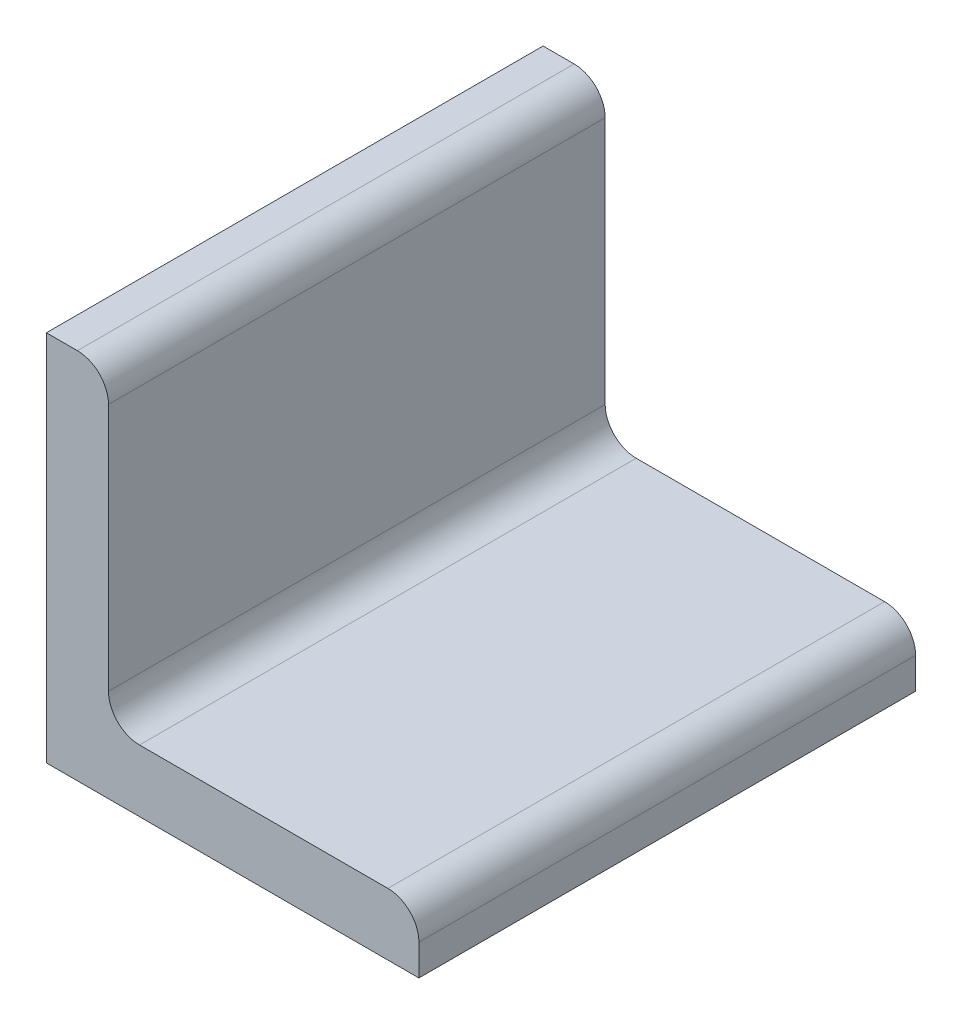
ISO-10303-21;
HEADER;
FILE_DESCRIPTION(('STEP AP214'),'2;1');
FILE_NAME('part.step','',(''),(''),'','','');
FILE_SCHEMA(('AUTOMOTIVE_DESIGN { 1 0 10303 214 1 1 1 1 }'));
ENDSEC;
DATA;
#1=APPLICATION_CONTEXT('core data for automotive mechanical design processes');
#2=APPLICATION_PROTOCOL_DEFINITION('international standard','automotive_design',2000,#1);
#3=PRODUCT_CONTEXT('',#1,'mechanical');
#4=PRODUCT('Part','Part','',(#3));
#5=PRODUCT_RELATED_PRODUCT_CATEGORY('part','',(#4));
#6=PRODUCT_DEFINITION_FORMATION('','',#4);
#7=PRODUCT_DEFINITION_CONTEXT('part definition',#1,'design');
#8=PRODUCT_DEFINITION('design','',#6,#7);
#9=PRODUCT_DEFINITION_SHAPE('','',#8);
#10=(LENGTH_UNIT() NAMED_UNIT(*) SI_UNIT(.MILLI.,.METRE.));
#11=(NAMED_UNIT(*) PLANE_ANGLE_UNIT() SI_UNIT($,.RADIAN.));
#12=(NAMED_UNIT(*) SI_UNIT($,.STERADIAN.) SOLID_ANGLE_UNIT());
#13=UNCERTAINTY_MEASURE_WITH_UNIT(LENGTH_MEASURE(1.E-05),#10,'distance_accuracy_value','');
#14=(GEOMETRIC_REPRESENTATION_CONTEXT(3) GLOBAL_UNCERTAINTY_ASSIGNED_CONTEXT((#13)) GLOBAL_UNIT_ASSIGNED_CONTEXT((#10,
#11,#12)) REPRESENTATION_CONTEXT('',''));
#15=CARTESIAN_POINT('',(0.,0.,0.));
#16=DIRECTION('',(0.,0.,1.));
#17=DIRECTION('',(1.,0.,0.));
#18=AXIS2_PLACEMENT_3D('',#15,#16,#17);
#19=CARTESIAN_POINT('',(3.175,3.175,12.7));
#20=DIRECTION('',(-1.,0.,0.));
#21=DIRECTION('',(0.,-1.,0.));
#22=AXIS2_PLACEMENT_3D('',#19,#20,#21);
#23=PLANE('',#22);
#24=DIRECTION('',(0.,1.,0.));
#25=VECTOR('',#24,1.);
#26=CARTESIAN_POINT('',(3.175,3.175,12.7));
#27=LINE('',#26,#25);
#28=CARTESIAN_POINT('',(3.175,4.7625,12.7));
#29=VERTEX_POINT('',#28);
#30=CARTESIAN_POINT('',(3.175,17.4625,12.7));
#31=VERTEX_POINT('',#30);
#32=EDGE_CURVE('E124',#29,#31,#27,.T.);
#33=ORIENTED_EDGE('',*,*,#32,.F.);
#34=DIRECTION('',(0.,0.,-1.));
#35=VECTOR('',#34,1.);
#36=CARTESIAN_POINT('',(3.175,4.7625,-12.7));
#37=LINE('',#36,#35);
#38=CARTESIAN_POINT('',(3.175,4.7625,-12.7));
#39=VERTEX_POINT('',#38);
#40=EDGE_CURVE('E201',#29,#39,#37,.T.);
#41=ORIENTED_EDGE('',*,*,#40,.T.);
#42=DIRECTION('',(0.,1.,0.));
#43=VECTOR('',#42,1.);
#44=CARTESIAN_POINT('',(3.175,3.175,-12.7));
#45=LINE('',#44,#43);
#46=CARTESIAN_POINT('',(3.175,17.4625,-12.7));
#47=VERTEX_POINT('',#46);
#48=EDGE_CURVE('E155',#39,#47,#45,.T.);
#49=ORIENTED_EDGE('',*,*,#48,.T.);
#50=DIRECTION('',(0.,0.,-1.));
#51=VECTOR('',#50,1.);
#52=CARTESIAN_POINT('',(3.175,17.4625,12.7));
#53=LINE('',#52,#51);
#54=EDGE_CURVE('E67',#47,#31,#53,.F.);
#55=ORIENTED_EDGE('',*,*,#54,.T.);
#56=EDGE_LOOP('',(#33,#41,#49,#55));
#57=FACE_BOUND('',#56,.T.);
#58=ADVANCED_FACE('F43',(#57),#23,.F.);
#59=CARTESIAN_POINT('',(3.175,19.05,12.7));
#60=DIRECTION('',(0.,-1.,0.));
#61=DIRECTION('',(0.,0.,-1.));
#62=AXIS2_PLACEMENT_3D('',#59,#60,#61);
#63=PLANE('',#62);
#64=DIRECTION('',(-1.,0.,0.));
#65=VECTOR('',#64,1.);
#66=CARTESIAN_POINT('',(3.175,19.05,12.7));
#67=LINE('',#66,#65);
#68=CARTESIAN_POINT('',(1.5875,19.05,12.7));
#69=VERTEX_POINT('',#68);
#70=CARTESIAN_POINT('',(0.,19.05,12.7));
#71=VERTEX_POINT('',#70);
#72=EDGE_CURVE('E113',#69,#71,#67,.T.);
#73=ORIENTED_EDGE('',*,*,#72,.F.);
#74=DIRECTION('',(0.,0.,-1.));
#75=VECTOR('',#74,1.);
#76=CARTESIAN_POINT('',(1.5875,19.05,12.7));
#77=LINE('',#76,#75);
#78=CARTESIAN_POINT('',(1.5875,19.05,-12.7));
#79=VERTEX_POINT('',#78);
#80=EDGE_CURVE('E205',#69,#79,#77,.T.);
#81=ORIENTED_EDGE('',*,*,#80,.T.);
#82=DIRECTION('',(-1.,0.,0.));
#83=VECTOR('',#82,1.);
#84=CARTESIAN_POINT('',(3.175,19.05,-12.7));
#85=LINE('',#84,#83);
#86=CARTESIAN_POINT('',(0.,19.05,-12.7));
#87=VERTEX_POINT('',#86);
#88=EDGE_CURVE('E130',#79,#87,#85,.T.);
#89=ORIENTED_EDGE('',*,*,#88,.T.);
#90=DIRECTION('',(0.,0.,-1.));
#91=VECTOR('',#90,1.);
#92=CARTESIAN_POINT('',(0.,19.05,12.7));
#93=LINE('',#92,#91);
#94=EDGE_CURVE('E127',#71,#87,#93,.T.);
#95=ORIENTED_EDGE('',*,*,#94,.F.);
#96=EDGE_LOOP('',(#73,#81,#89,#95));
#97=FACE_BOUND('',#96,.T.);
#98=ADVANCED_FACE('F128',(#97),#63,.F.);
#99=CARTESIAN_POINT('',(0.,19.05,12.7));
#100=DIRECTION('',(1.,0.,0.));
#101=DIRECTION('',(0.,1.,0.));
#102=AXIS2_PLACEMENT_3D('',#99,#100,#101);
#103=PLANE('',#102);
#104=DIRECTION('',(0.,-1.,0.));
#105=VECTOR('',#104,1.);
#106=CARTESIAN_POINT('',(0.,19.05,-12.7));
#107=LINE('',#106,#105);
#108=CARTESIAN_POINT('',(0.,0.,-12.7));
#109=VERTEX_POINT('',#108);
#110=EDGE_CURVE('E160',#87,#109,#107,.T.);
#111=ORIENTED_EDGE('',*,*,#110,.T.);
#112=DIRECTION('',(0.,0.,-1.));
#113=VECTOR('',#112,1.);
#114=CARTESIAN_POINT('',(0.,0.,12.7));
#115=LINE('',#114,#113);
#116=CARTESIAN_POINT('',(0.,0.,12.7));
#117=VERTEX_POINT('',#116);
#118=EDGE_CURVE('E135',#117,#109,#115,.T.);
#119=ORIENTED_EDGE('',*,*,#118,.F.);
#120=DIRECTION('',(0.,-1.,0.));
#121=VECTOR('',#120,1.);
#122=CARTESIAN_POINT('',(0.,19.05,12.7));
#123=LINE('',#122,#121);
#124=EDGE_CURVE('E118',#71,#117,#123,.T.);
#125=ORIENTED_EDGE('',*,*,#124,.F.);
#126=ORIENTED_EDGE('',*,*,#94,.T.);
#127=EDGE_LOOP('',(#111,#119,#125,#126));
#128=FACE_BOUND('',#127,.T.);
#129=ADVANCED_FACE('F137',(#128),#103,.F.);
#130=CARTESIAN_POINT('',(0.,0.,12.7));
#131=DIRECTION('',(0.,1.,0.));
#132=DIRECTION('',(0.,0.,1.));
#133=AXIS2_PLACEMENT_3D('',#130,#131,#132);
#134=PLANE('',#133);
#135=DIRECTION('',(1.,0.,0.));
#136=VECTOR('',#135,1.);
#137=CARTESIAN_POINT('',(0.,0.,-12.7));
#138=LINE('',#137,#136);
#139=CARTESIAN_POINT('',(19.05,0.,-12.7));
#140=VERTEX_POINT('',#139);
#141=EDGE_CURVE('E163',#109,#140,#138,.T.);
#142=ORIENTED_EDGE('',*,*,#141,.T.);
#143=DIRECTION('',(0.,0.,-1.));
#144=VECTOR('',#143,1.);
#145=CARTESIAN_POINT('',(19.05,0.,12.7));
#146=LINE('',#145,#144);
#147=CARTESIAN_POINT('',(19.05,0.,12.7));
#148=VERTEX_POINT('',#147);
#149=EDGE_CURVE('E154',#148,#140,#146,.T.);
#150=ORIENTED_EDGE('',*,*,#149,.F.);
#151=DIRECTION('',(1.,0.,0.));
#152=VECTOR('',#151,1.);
#153=CARTESIAN_POINT('',(0.,0.,12.7));
#154=LINE('',#153,#152);
#155=EDGE_CURVE('E141',#117,#148,#154,.T.);
#156=ORIENTED_EDGE('',*,*,#155,.F.);
#157=ORIENTED_EDGE('',*,*,#118,.T.);
#158=EDGE_LOOP('',(#142,#150,#156,#157));
#159=FACE_BOUND('',#158,.T.);
#160=ADVANCED_FACE('F226',(#159),#134,.F.);
#161=CARTESIAN_POINT('',(19.05,0.,12.7));
#162=DIRECTION('',(-1.,0.,0.));
#163=DIRECTION('',(0.,0.,1.));
#164=AXIS2_PLACEMENT_3D('',#161,#162,#163);
#165=PLANE('',#164);
#166=DIRECTION('',(0.,1.,0.));
#167=VECTOR('',#166,1.);
#168=CARTESIAN_POINT('',(19.05,0.,-12.7));
#169=LINE('',#168,#167);
#170=CARTESIAN_POINT('',(19.05,1.5875,-12.7));
#171=VERTEX_POINT('',#170);
#172=EDGE_CURVE('E166',#140,#171,#169,.T.);
#173=ORIENTED_EDGE('',*,*,#172,.T.);
#174=DIRECTION('',(0.,0.,-1.));
#175=VECTOR('',#174,1.);
#176=CARTESIAN_POINT('',(19.05,1.5875,12.7));
#177=LINE('',#176,#175);
#178=CARTESIAN_POINT('',(19.05,1.5875,12.7));
#179=VERTEX_POINT('',#178);
#180=EDGE_CURVE('E191',#171,#179,#177,.F.);
#181=ORIENTED_EDGE('',*,*,#180,.T.);
#182=DIRECTION('',(0.,1.,0.));
#183=VECTOR('',#182,1.);
#184=CARTESIAN_POINT('',(19.05,0.,12.7));
#185=LINE('',#184,#183);
#186=EDGE_CURVE('E144',#148,#179,#185,.T.);
#187=ORIENTED_EDGE('',*,*,#186,.F.);
#188=ORIENTED_EDGE('',*,*,#149,.T.);
#189=EDGE_LOOP('',(#173,#181,#187,#188));
#190=FACE_BOUND('',#189,.T.);
#191=ADVANCED_FACE('F234',(#190),#165,.F.);
#192=CARTESIAN_POINT('',(19.05,3.175,12.7));
#193=DIRECTION('',(0.,-1.,0.));
#194=DIRECTION('',(1.,0.,0.));
#195=AXIS2_PLACEMENT_3D('',#192,#193,#194);
#196=PLANE('',#195);
#197=DIRECTION('',(-1.,0.,0.));
#198=VECTOR('',#197,1.);
#199=CARTESIAN_POINT('',(19.05,3.175,12.7));
#200=LINE('',#199,#198);
#201=CARTESIAN_POINT('',(17.4625,3.175,12.7));
#202=VERTEX_POINT('',#201);
#203=CARTESIAN_POINT('',(4.7625,3.175,12.7));
#204=VERTEX_POINT('',#203);
#205=EDGE_CURVE('E150',#202,#204,#200,.T.);
#206=ORIENTED_EDGE('',*,*,#205,.F.);
#207=DIRECTION('',(0.,0.,-1.));
#208=VECTOR('',#207,1.);
#209=CARTESIAN_POINT('',(17.4625,3.175,12.7));
#210=LINE('',#209,#208);
#211=CARTESIAN_POINT('',(17.4625,3.175,-12.7));
#212=VERTEX_POINT('',#211);
#213=EDGE_CURVE('E181',#202,#212,#210,.T.);
#214=ORIENTED_EDGE('',*,*,#213,.T.);
#215=DIRECTION('',(-1.,0.,0.));
#216=VECTOR('',#215,1.);
#217=CARTESIAN_POINT('',(19.05,3.175,-12.7));
#218=LINE('',#217,#216);
#219=CARTESIAN_POINT('',(4.7625,3.175,-12.7));
#220=VERTEX_POINT('',#219);
#221=EDGE_CURVE('E170',#212,#220,#218,.T.);
#222=ORIENTED_EDGE('',*,*,#221,.T.);
#223=DIRECTION('',(0.,0.,-1.));
#224=VECTOR('',#223,1.);
#225=CARTESIAN_POINT('',(4.7625,3.175,12.7));
#226=LINE('',#225,#224);
#227=EDGE_CURVE('E134',#220,#204,#226,.F.);
#228=ORIENTED_EDGE('',*,*,#227,.T.);
#229=EDGE_LOOP('',(#206,#214,#222,#228));
#230=FACE_BOUND('',#229,.T.);
#231=ADVANCED_FACE('F217',(#230),#196,.F.);
#232=CARTESIAN_POINT('',(0.,0.,12.7));
#233=DIRECTION('',(0.,0.,1.));
#234=DIRECTION('',(1.,0.,0.));
#235=AXIS2_PLACEMENT_3D('',#232,#233,#234);
#236=PLANE('',#235);
#237=ORIENTED_EDGE('',*,*,#186,.T.);
#238=CARTESIAN_POINT('',(17.4625,1.5875,12.7));
#239=DIRECTION('',(0.,0.,1.));
#240=DIRECTION('',(1.,0.,0.));
#241=AXIS2_PLACEMENT_3D('',#238,#239,#240);
#242=CIRCLE('',#241,1.5875);
#243=EDGE_CURVE('E196',#179,#202,#242,.T.);
#244=ORIENTED_EDGE('',*,*,#243,.T.);
#245=ORIENTED_EDGE('',*,*,#205,.T.);
#246=CARTESIAN_POINT('',(4.7625,4.7625,12.7));
#247=DIRECTION('',(0.,0.,1.));
#248=DIRECTION('',(1.,0.,0.));
#249=AXIS2_PLACEMENT_3D('',#246,#247,#248);
#250=CIRCLE('',#249,1.5875);
#251=EDGE_CURVE('E11',#204,#29,#250,.F.);
#252=ORIENTED_EDGE('',*,*,#251,.T.);
#253=ORIENTED_EDGE('',*,*,#32,.T.);
#254=CARTESIAN_POINT('',(1.5875,17.4625,12.7));
#255=DIRECTION('',(0.,0.,1.));
#256=DIRECTION('',(1.,0.,0.));
#257=AXIS2_PLACEMENT_3D('',#254,#255,#256);
#258=CIRCLE('',#257,1.5875);
#259=EDGE_CURVE('E59',#31,#69,#258,.T.);
#260=ORIENTED_EDGE('',*,*,#259,.T.);
#261=ORIENTED_EDGE('',*,*,#72,.T.);
#262=ORIENTED_EDGE('',*,*,#124,.T.);
#263=ORIENTED_EDGE('',*,*,#155,.T.);
#264=EDGE_LOOP('',(#237,#244,#245,#252,#253,#260,#261,#262,#263));
#265=FACE_BOUND('',#264,.T.);
#266=ADVANCED_FACE('F116',(#265),#236,.T.);
#267=CARTESIAN_POINT('',(0.,0.,-12.7));
#268=DIRECTION('',(0.,0.,1.));
#269=DIRECTION('',(1.,0.,0.));
#270=AXIS2_PLACEMENT_3D('',#267,#268,#269);
#271=PLANE('',#270);
#272=ORIENTED_EDGE('',*,*,#221,.F.);
#273=CARTESIAN_POINT('',(17.4625,1.5875,-12.7));
#274=DIRECTION('',(0.,0.,1.));
#275=DIRECTION('',(1.,0.,0.));
#276=AXIS2_PLACEMENT_3D('',#273,#274,#275);
#277=CIRCLE('',#276,1.5875);
#278=EDGE_CURVE('E188',#212,#171,#277,.F.);
#279=ORIENTED_EDGE('',*,*,#278,.T.);
#280=ORIENTED_EDGE('',*,*,#172,.F.);
#281=ORIENTED_EDGE('',*,*,#141,.F.);
#282=ORIENTED_EDGE('',*,*,#110,.F.);
#283=ORIENTED_EDGE('',*,*,#88,.F.);
#284=CARTESIAN_POINT('',(1.5875,17.4625,-12.7));
#285=DIRECTION('',(0.,0.,1.));
#286=DIRECTION('',(1.,0.,0.));
#287=AXIS2_PLACEMENT_3D('',#284,#285,#286);
#288=CIRCLE('',#287,1.5875);
#289=EDGE_CURVE('E185',#79,#47,#288,.F.);
#290=ORIENTED_EDGE('',*,*,#289,.T.);
#291=ORIENTED_EDGE('',*,*,#48,.F.);
#292=CARTESIAN_POINT('',(4.7625,4.7625,-12.7));
#293=DIRECTION('',(0.,0.,1.));
#294=DIRECTION('',(1.,0.,0.));
#295=AXIS2_PLACEMENT_3D('',#292,#293,#294);
#296=CIRCLE('',#295,1.5875);
#297=EDGE_CURVE('E52',#39,#220,#296,.T.);
#298=ORIENTED_EDGE('',*,*,#297,.T.);
#299=EDGE_LOOP('',(#272,#279,#280,#281,#282,#283,#290,#291,#298));
#300=FACE_BOUND('',#299,.T.);
#301=ADVANCED_FACE('F211',(#300),#271,.F.);
#302=CARTESIAN_POINT('',(17.4625,1.5875,12.7));
#303=DIRECTION('',(0.,0.,-1.));
#304=DIRECTION('',(-1.,0.,0.));
#305=AXIS2_PLACEMENT_3D('',#302,#303,#304);
#306=CYLINDRICAL_SURFACE('',#305,1.5875);
#307=ORIENTED_EDGE('',*,*,#243,.F.);
#308=ORIENTED_EDGE('',*,*,#180,.F.);
#309=ORIENTED_EDGE('',*,*,#278,.F.);
#310=ORIENTED_EDGE('',*,*,#213,.F.);
#311=EDGE_LOOP('',(#307,#308,#309,#310));
#312=FACE_BOUND('',#311,.T.);
#313=ADVANCED_FACE('F233',(#312),#306,.T.);
#314=CARTESIAN_POINT('',(4.7625,4.7625,12.7));
#315=DIRECTION('',(0.,0.,1.));
#316=DIRECTION('',(1.,0.,0.));
#317=AXIS2_PLACEMENT_3D('',#314,#315,#316);
#318=CYLINDRICAL_SURFACE('',#317,1.5875);
#319=ORIENTED_EDGE('',*,*,#251,.F.);
#320=ORIENTED_EDGE('',*,*,#227,.F.);
#321=ORIENTED_EDGE('',*,*,#297,.F.);
#322=ORIENTED_EDGE('',*,*,#40,.F.);
#323=EDGE_LOOP('',(#319,#320,#321,#322));
#324=FACE_BOUND('',#323,.T.);
#325=ADVANCED_FACE('F220',(#324),#318,.F.);
#326=CARTESIAN_POINT('',(1.5875,17.4625,12.7));
#327=DIRECTION('',(0.,0.,-1.));
#328=DIRECTION('',(-1.,0.,0.));
#329=AXIS2_PLACEMENT_3D('',#326,#327,#328);
#330=CYLINDRICAL_SURFACE('',#329,1.5875);
#331=ORIENTED_EDGE('',*,*,#259,.F.);
#332=ORIENTED_EDGE('',*,*,#54,.F.);
#333=ORIENTED_EDGE('',*,*,#289,.F.);
#334=ORIENTED_EDGE('',*,*,#80,.F.);
#335=EDGE_LOOP('',(#331,#332,#333,#334));
#336=FACE_BOUND('',#335,.T.);
#337=ADVANCED_FACE('F45',(#336),#330,.T.);
#338=CLOSED_SHELL('',(#58,#98,#129,#160,#191,#231,#266,#301,#313,#325,#337));
#339=MANIFOLD_SOLID_BREP('B2',#338);
#340=ADVANCED_BREP_SHAPE_REPRESENTATION('',(#18,#339),#14);
#341=SHAPE_DEFINITION_REPRESENTATION(#9,#340);
ENDSEC;
END-ISO-10303-21;
